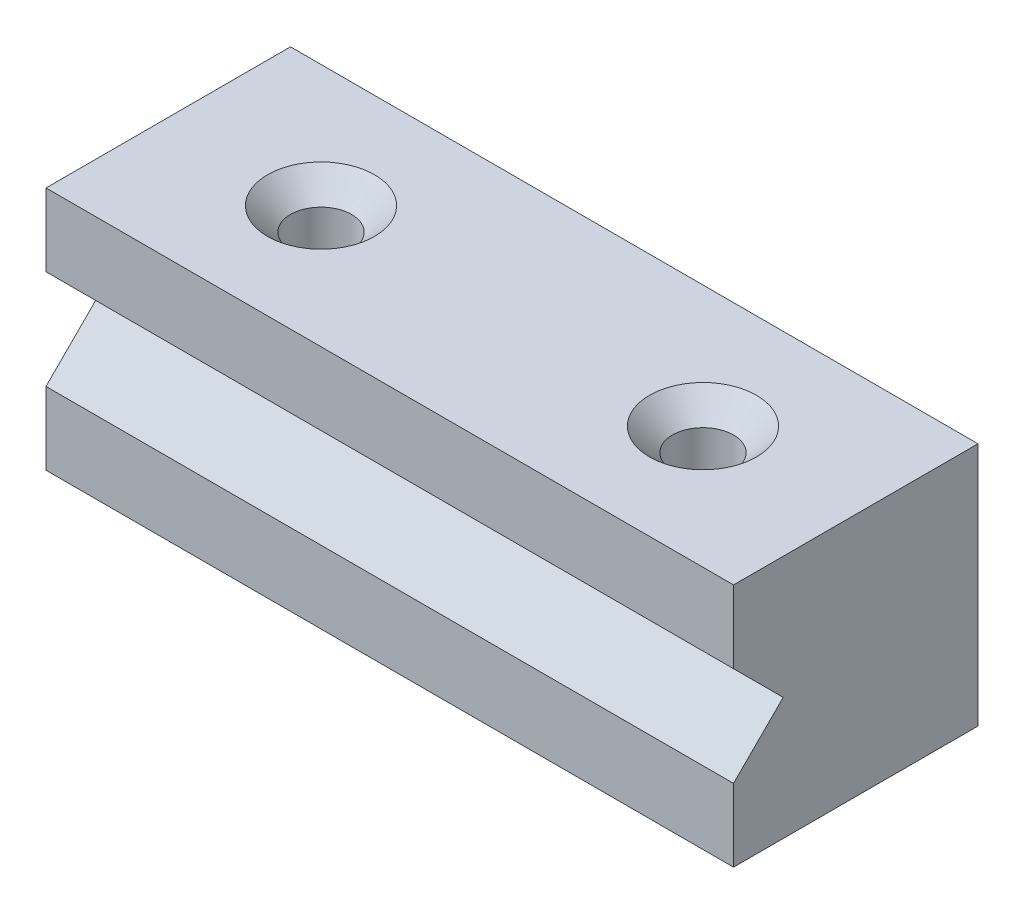
ISO-10303-21;
HEADER;
FILE_DESCRIPTION(('STEP AP214'),'2;1');
FILE_NAME('part.step','',(''),(''),'','','');
FILE_SCHEMA(('AUTOMOTIVE_DESIGN { 1 0 10303 214 1 1 1 1 }'));
ENDSEC;
DATA;
#1=APPLICATION_CONTEXT('core data for automotive mechanical design processes');
#2=APPLICATION_PROTOCOL_DEFINITION('international standard','automotive_design',2000,#1);
#3=PRODUCT_CONTEXT('',#1,'mechanical');
#4=PRODUCT('Part','Part','',(#3));
#5=PRODUCT_RELATED_PRODUCT_CATEGORY('part','',(#4));
#6=PRODUCT_DEFINITION_FORMATION('','',#4);
#7=PRODUCT_DEFINITION_CONTEXT('part definition',#1,'design');
#8=PRODUCT_DEFINITION('design','',#6,#7);
#9=PRODUCT_DEFINITION_SHAPE('','',#8);
#10=(LENGTH_UNIT() NAMED_UNIT(*) SI_UNIT(.MILLI.,.METRE.));
#11=(NAMED_UNIT(*) PLANE_ANGLE_UNIT() SI_UNIT($,.RADIAN.));
#12=(NAMED_UNIT(*) SI_UNIT($,.STERADIAN.) SOLID_ANGLE_UNIT());
#13=UNCERTAINTY_MEASURE_WITH_UNIT(LENGTH_MEASURE(1.E-05),#10,'distance_accuracy_value','');
#14=(GEOMETRIC_REPRESENTATION_CONTEXT(3) GLOBAL_UNCERTAINTY_ASSIGNED_CONTEXT((#13)) GLOBAL_UNIT_ASSIGNED_CONTEXT((#10,
#11,#12)) REPRESENTATION_CONTEXT('',''));
#15=CARTESIAN_POINT('',(0.,0.,0.));
#16=DIRECTION('',(0.,0.,1.));
#17=DIRECTION('',(1.,0.,0.));
#18=AXIS2_PLACEMENT_3D('',#15,#16,#17);
#19=CARTESIAN_POINT('',(45.,-4.74999999999999,4.74999999999997));
#20=DIRECTION('',(0.,0.707106781186549,-0.707106781186546));
#21=DIRECTION('',(0.,0.707106781186546,0.707106781186549));
#22=AXIS2_PLACEMENT_3D('',#19,#20,#21);
#23=PLANE('',#22);
#24=DIRECTION('',(0.,-0.707106781186546,-0.707106781186549));
#25=VECTOR('',#24,1.);
#26=CARTESIAN_POINT('',(-45.,-4.74999999999999,4.74999999999997));
#27=LINE('',#26,#25);
#28=CARTESIAN_POINT('',(-45.,6.5,16.));
#29=VERTEX_POINT('',#28);
#30=CARTESIAN_POINT('',(-45.,0.,9.49999999999998));
#31=VERTEX_POINT('',#30);
#32=EDGE_CURVE('E139',#29,#31,#27,.T.);
#33=ORIENTED_EDGE('',*,*,#32,.T.);
#34=DIRECTION('',(-1.,0.,0.));
#35=VECTOR('',#34,1.);
#36=CARTESIAN_POINT('',(45.,0.,9.49999999999998));
#37=LINE('',#36,#35);
#38=CARTESIAN_POINT('',(45.,0.,9.49999999999998));
#39=VERTEX_POINT('',#38);
#40=EDGE_CURVE('E173',#39,#31,#37,.T.);
#41=ORIENTED_EDGE('',*,*,#40,.F.);
#42=DIRECTION('',(0.,-0.707106781186546,-0.707106781186549));
#43=VECTOR('',#42,1.);
#44=CARTESIAN_POINT('',(45.,-4.74999999999999,4.74999999999997));
#45=LINE('',#44,#43);
#46=CARTESIAN_POINT('',(45.,6.5,16.));
#47=VERTEX_POINT('',#46);
#48=EDGE_CURVE('E210',#47,#39,#45,.T.);
#49=ORIENTED_EDGE('',*,*,#48,.F.);
#50=DIRECTION('',(-1.,0.,0.));
#51=VECTOR('',#50,1.);
#52=CARTESIAN_POINT('',(45.,6.5,16.));
#53=LINE('',#52,#51);
#54=EDGE_CURVE('E134',#47,#29,#53,.T.);
#55=ORIENTED_EDGE('',*,*,#54,.T.);
#56=EDGE_LOOP('',(#33,#41,#49,#55));
#57=FACE_BOUND('',#56,.T.);
#58=ADVANCED_FACE('F42',(#57),#23,.F.);
#59=CARTESIAN_POINT('',(45.,4.74999999999999,4.74999999999997));
#60=DIRECTION('',(0.,-0.707106781186549,-0.707106781186546));
#61=DIRECTION('',(0.,0.707106781186546,-0.707106781186549));
#62=AXIS2_PLACEMENT_3D('',#59,#60,#61);
#63=PLANE('',#62);
#64=DIRECTION('',(0.,-0.707106781186546,0.707106781186549));
#65=VECTOR('',#64,1.);
#66=CARTESIAN_POINT('',(-45.,4.74999999999999,4.74999999999997));
#67=LINE('',#66,#65);
#68=CARTESIAN_POINT('',(-45.,-6.5,16.));
#69=VERTEX_POINT('',#68);
#70=EDGE_CURVE('E143',#31,#69,#67,.T.);
#71=ORIENTED_EDGE('',*,*,#70,.T.);
#72=DIRECTION('',(-1.,0.,0.));
#73=VECTOR('',#72,1.);
#74=CARTESIAN_POINT('',(45.,-6.5,16.));
#75=LINE('',#74,#73);
#76=CARTESIAN_POINT('',(45.,-6.5,16.));
#77=VERTEX_POINT('',#76);
#78=EDGE_CURVE('E169',#77,#69,#75,.T.);
#79=ORIENTED_EDGE('',*,*,#78,.F.);
#80=DIRECTION('',(0.,-0.707106781186546,0.707106781186549));
#81=VECTOR('',#80,1.);
#82=CARTESIAN_POINT('',(45.,4.74999999999999,4.74999999999997));
#83=LINE('',#82,#81);
#84=EDGE_CURVE('E98',#39,#77,#83,.T.);
#85=ORIENTED_EDGE('',*,*,#84,.F.);
#86=ORIENTED_EDGE('',*,*,#40,.T.);
#87=EDGE_LOOP('',(#71,#79,#85,#86));
#88=FACE_BOUND('',#87,.T.);
#89=ADVANCED_FACE('F241',(#88),#63,.F.);
#90=CARTESIAN_POINT('',(45.,0.,16.));
#91=DIRECTION('',(0.,0.,-1.));
#92=DIRECTION('',(0.,1.,0.));
#93=AXIS2_PLACEMENT_3D('',#90,#91,#92);
#94=PLANE('',#93);
#95=DIRECTION('',(0.,-1.,0.));
#96=VECTOR('',#95,1.);
#97=CARTESIAN_POINT('',(-45.,0.,16.));
#98=LINE('',#97,#96);
#99=CARTESIAN_POINT('',(-45.,-16.,16.));
#100=VERTEX_POINT('',#99);
#101=EDGE_CURVE('E147',#69,#100,#98,.T.);
#102=ORIENTED_EDGE('',*,*,#101,.T.);
#103=DIRECTION('',(-1.,0.,0.));
#104=VECTOR('',#103,1.);
#105=CARTESIAN_POINT('',(45.,-16.,16.));
#106=LINE('',#105,#104);
#107=CARTESIAN_POINT('',(45.,-16.,16.));
#108=VERTEX_POINT('',#107);
#109=EDGE_CURVE('E165',#108,#100,#106,.T.);
#110=ORIENTED_EDGE('',*,*,#109,.F.);
#111=DIRECTION('',(0.,-1.,0.));
#112=VECTOR('',#111,1.);
#113=CARTESIAN_POINT('',(45.,0.,16.));
#114=LINE('',#113,#112);
#115=EDGE_CURVE('E136',#77,#108,#114,.T.);
#116=ORIENTED_EDGE('',*,*,#115,.F.);
#117=ORIENTED_EDGE('',*,*,#78,.T.);
#118=EDGE_LOOP('',(#102,#110,#116,#117));
#119=FACE_BOUND('',#118,.T.);
#120=ADVANCED_FACE('F220',(#119),#94,.F.);
#121=CARTESIAN_POINT('',(45.,-16.,0.));
#122=DIRECTION('',(0.,1.,0.));
#123=DIRECTION('',(0.,0.,1.));
#124=AXIS2_PLACEMENT_3D('',#121,#122,#123);
#125=PLANE('',#124);
#126=CARTESIAN_POINT('',(25.,-16.,0.));
#127=DIRECTION('',(0.,1.,0.));
#128=DIRECTION('',(0.,0.,1.));
#129=AXIS2_PLACEMENT_3D('',#126,#127,#128);
#130=CIRCLE('',#129,4.);
#131=CARTESIAN_POINT('',(25.,-16.,4.));
#132=VERTEX_POINT('',#131);
#133=EDGE_CURVE('E204',#132,#132,#130,.T.);
#134=ORIENTED_EDGE('',*,*,#133,.T.);
#135=EDGE_LOOP('',(#134));
#136=FACE_BOUND('',#135,.T.);
#137=CARTESIAN_POINT('',(-25.,-16.,0.));
#138=DIRECTION('',(0.,1.,0.));
#139=DIRECTION('',(0.,0.,1.));
#140=AXIS2_PLACEMENT_3D('',#137,#138,#139);
#141=CIRCLE('',#140,4.);
#142=CARTESIAN_POINT('',(-25.,-16.,4.));
#143=VERTEX_POINT('',#142);
#144=EDGE_CURVE('E144',#143,#143,#141,.T.);
#145=ORIENTED_EDGE('',*,*,#144,.T.);
#146=EDGE_LOOP('',(#145));
#147=FACE_BOUND('',#146,.T.);
#148=DIRECTION('',(0.,0.,-1.));
#149=VECTOR('',#148,1.);
#150=CARTESIAN_POINT('',(-45.,-16.,0.));
#151=LINE('',#150,#149);
#152=CARTESIAN_POINT('',(-45.,-16.,-16.));
#153=VERTEX_POINT('',#152);
#154=EDGE_CURVE('E150',#100,#153,#151,.T.);
#155=ORIENTED_EDGE('',*,*,#154,.T.);
#156=DIRECTION('',(-1.,0.,0.));
#157=VECTOR('',#156,1.);
#158=CARTESIAN_POINT('',(45.,-16.,-16.));
#159=LINE('',#158,#157);
#160=CARTESIAN_POINT('',(45.,-16.,-16.));
#161=VERTEX_POINT('',#160);
#162=EDGE_CURVE('E121',#161,#153,#159,.T.);
#163=ORIENTED_EDGE('',*,*,#162,.F.);
#164=DIRECTION('',(0.,0.,-1.));
#165=VECTOR('',#164,1.);
#166=CARTESIAN_POINT('',(45.,-16.,0.));
#167=LINE('',#166,#165);
#168=EDGE_CURVE('E126',#108,#161,#167,.T.);
#169=ORIENTED_EDGE('',*,*,#168,.F.);
#170=ORIENTED_EDGE('',*,*,#109,.T.);
#171=EDGE_LOOP('',(#155,#163,#169,#170));
#172=FACE_BOUND('',#171,.T.);
#173=ADVANCED_FACE('F224',(#136,#147,#172),#125,.F.);
#174=CARTESIAN_POINT('',(45.,0.,-16.));
#175=DIRECTION('',(0.,0.,-1.));
#176=DIRECTION('',(0.,1.,0.));
#177=AXIS2_PLACEMENT_3D('',#174,#175,#176);
#178=PLANE('',#177);
#179=DIRECTION('',(0.,-1.,0.));
#180=VECTOR('',#179,1.);
#181=CARTESIAN_POINT('',(-45.,0.,-16.));
#182=LINE('',#181,#180);
#183=CARTESIAN_POINT('',(-45.,16.,-16.));
#184=VERTEX_POINT('',#183);
#185=EDGE_CURVE('E115',#184,#153,#182,.T.);
#186=ORIENTED_EDGE('',*,*,#185,.F.);
#187=DIRECTION('',(-1.,0.,0.));
#188=VECTOR('',#187,1.);
#189=CARTESIAN_POINT('',(45.,16.,-16.));
#190=LINE('',#189,#188);
#191=CARTESIAN_POINT('',(45.,16.,-16.));
#192=VERTEX_POINT('',#191);
#193=EDGE_CURVE('E110',#192,#184,#190,.T.);
#194=ORIENTED_EDGE('',*,*,#193,.F.);
#195=DIRECTION('',(0.,-1.,0.));
#196=VECTOR('',#195,1.);
#197=CARTESIAN_POINT('',(45.,0.,-16.));
#198=LINE('',#197,#196);
#199=EDGE_CURVE('E113',#192,#161,#198,.T.);
#200=ORIENTED_EDGE('',*,*,#199,.T.);
#201=ORIENTED_EDGE('',*,*,#162,.T.);
#202=EDGE_LOOP('',(#186,#194,#200,#201));
#203=FACE_BOUND('',#202,.T.);
#204=ADVANCED_FACE('F112',(#203),#178,.T.);
#205=CARTESIAN_POINT('',(45.,16.,0.));
#206=DIRECTION('',(0.,1.,0.));
#207=DIRECTION('',(0.,0.,1.));
#208=AXIS2_PLACEMENT_3D('',#205,#206,#207);
#209=PLANE('',#208);
#210=CARTESIAN_POINT('',(-25.,16.,0.));
#211=DIRECTION('',(0.,1.,0.));
#212=DIRECTION('',(0.,0.,1.));
#213=AXIS2_PLACEMENT_3D('',#210,#211,#212);
#214=CIRCLE('',#213,7.00000000000003);
#215=CARTESIAN_POINT('',(-25.,16.,7.00000000000003));
#216=VERTEX_POINT('',#215);
#217=EDGE_CURVE('E53',#216,#216,#214,.F.);
#218=ORIENTED_EDGE('',*,*,#217,.T.);
#219=EDGE_LOOP('',(#218));
#220=FACE_BOUND('',#219,.T.);
#221=CARTESIAN_POINT('',(25.,16.,0.));
#222=DIRECTION('',(0.,1.,0.));
#223=DIRECTION('',(0.,0.,1.));
#224=AXIS2_PLACEMENT_3D('',#221,#222,#223);
#225=CIRCLE('',#224,7.00000000000003);
#226=CARTESIAN_POINT('',(25.,16.,7.00000000000003));
#227=VERTEX_POINT('',#226);
#228=EDGE_CURVE('E180',#227,#227,#225,.F.);
#229=ORIENTED_EDGE('',*,*,#228,.T.);
#230=EDGE_LOOP('',(#229));
#231=FACE_BOUND('',#230,.T.);
#232=DIRECTION('',(0.,0.,-1.));
#233=VECTOR('',#232,1.);
#234=CARTESIAN_POINT('',(-45.,16.,0.));
#235=LINE('',#234,#233);
#236=CARTESIAN_POINT('',(-45.,16.,16.));
#237=VERTEX_POINT('',#236);
#238=EDGE_CURVE('E156',#237,#184,#235,.T.);
#239=ORIENTED_EDGE('',*,*,#238,.F.);
#240=DIRECTION('',(-1.,0.,0.));
#241=VECTOR('',#240,1.);
#242=CARTESIAN_POINT('',(45.,16.,16.));
#243=LINE('',#242,#241);
#244=CARTESIAN_POINT('',(45.,16.,16.));
#245=VERTEX_POINT('',#244);
#246=EDGE_CURVE('E86',#245,#237,#243,.T.);
#247=ORIENTED_EDGE('',*,*,#246,.F.);
#248=DIRECTION('',(0.,0.,-1.));
#249=VECTOR('',#248,1.);
#250=CARTESIAN_POINT('',(45.,16.,0.));
#251=LINE('',#250,#249);
#252=EDGE_CURVE('E124',#245,#192,#251,.T.);
#253=ORIENTED_EDGE('',*,*,#252,.T.);
#254=ORIENTED_EDGE('',*,*,#193,.T.);
#255=EDGE_LOOP('',(#239,#247,#253,#254));
#256=FACE_BOUND('',#255,.T.);
#257=ADVANCED_FACE('F130',(#220,#231,#256),#209,.T.);
#258=EDGE_CURVE('E89',#237,#29,#98,.T.);
#259=ORIENTED_EDGE('',*,*,#258,.T.);
#260=ORIENTED_EDGE('',*,*,#54,.F.);
#261=EDGE_CURVE('E61',#245,#47,#114,.T.);
#262=ORIENTED_EDGE('',*,*,#261,.F.);
#263=ORIENTED_EDGE('',*,*,#246,.T.);
#264=EDGE_LOOP('',(#259,#260,#262,#263));
#265=FACE_BOUND('',#264,.T.);
#266=ADVANCED_FACE('F230',(#265),#94,.F.);
#267=CARTESIAN_POINT('',(45.,0.,0.));
#268=DIRECTION('',(1.,0.,0.));
#269=DIRECTION('',(0.,0.,-1.));
#270=AXIS2_PLACEMENT_3D('',#267,#268,#269);
#271=PLANE('',#270);
#272=ORIENTED_EDGE('',*,*,#48,.T.);
#273=ORIENTED_EDGE('',*,*,#84,.T.);
#274=ORIENTED_EDGE('',*,*,#115,.T.);
#275=ORIENTED_EDGE('',*,*,#168,.T.);
#276=ORIENTED_EDGE('',*,*,#199,.F.);
#277=ORIENTED_EDGE('',*,*,#252,.F.);
#278=ORIENTED_EDGE('',*,*,#261,.T.);
#279=EDGE_LOOP('',(#272,#273,#274,#275,#276,#277,#278));
#280=FACE_BOUND('',#279,.T.);
#281=ADVANCED_FACE('F123',(#280),#271,.T.);
#282=CARTESIAN_POINT('',(-45.,0.,0.));
#283=DIRECTION('',(1.,0.,0.));
#284=DIRECTION('',(0.,0.,-1.));
#285=AXIS2_PLACEMENT_3D('',#282,#283,#284);
#286=PLANE('',#285);
#287=ORIENTED_EDGE('',*,*,#32,.F.);
#288=ORIENTED_EDGE('',*,*,#258,.F.);
#289=ORIENTED_EDGE('',*,*,#238,.T.);
#290=ORIENTED_EDGE('',*,*,#185,.T.);
#291=ORIENTED_EDGE('',*,*,#154,.F.);
#292=ORIENTED_EDGE('',*,*,#101,.F.);
#293=ORIENTED_EDGE('',*,*,#70,.F.);
#294=EDGE_LOOP('',(#287,#288,#289,#290,#291,#292,#293));
#295=FACE_BOUND('',#294,.T.);
#296=ADVANCED_FACE('F198',(#295),#286,.F.);
#297=CARTESIAN_POINT('',(-25.,16.,0.));
#298=DIRECTION('',(0.,1.,0.));
#299=DIRECTION('',(0.,0.,1.));
#300=AXIS2_PLACEMENT_3D('',#297,#298,#299);
#301=CYLINDRICAL_SURFACE('',#300,4.);
#302=CARTESIAN_POINT('',(-25.,13.,0.));
#303=DIRECTION('',(0.,1.,0.));
#304=DIRECTION('',(0.,0.,1.));
#305=AXIS2_PLACEMENT_3D('',#302,#303,#304);
#306=CIRCLE('',#305,4.);
#307=CARTESIAN_POINT('',(-25.,13.,4.));
#308=VERTEX_POINT('',#307);
#309=EDGE_CURVE('E176',#308,#308,#306,.T.);
#310=ORIENTED_EDGE('',*,*,#309,.T.);
#311=EDGE_LOOP('',(#310));
#312=FACE_BOUND('',#311,.T.);
#313=ORIENTED_EDGE('',*,*,#144,.F.);
#314=EDGE_LOOP('',(#313));
#315=FACE_BOUND('',#314,.T.);
#316=ADVANCED_FACE('F195',(#312,#315),#301,.F.);
#317=CARTESIAN_POINT('',(25.,16.,0.));
#318=DIRECTION('',(0.,1.,0.));
#319=DIRECTION('',(0.,0.,1.));
#320=AXIS2_PLACEMENT_3D('',#317,#318,#319);
#321=CYLINDRICAL_SURFACE('',#320,4.);
#322=CARTESIAN_POINT('',(25.,13.,0.));
#323=DIRECTION('',(0.,1.,0.));
#324=DIRECTION('',(0.,0.,1.));
#325=AXIS2_PLACEMENT_3D('',#322,#323,#324);
#326=CIRCLE('',#325,4.);
#327=CARTESIAN_POINT('',(25.,13.,4.));
#328=VERTEX_POINT('',#327);
#329=EDGE_CURVE('E11',#328,#328,#326,.T.);
#330=ORIENTED_EDGE('',*,*,#329,.T.);
#331=EDGE_LOOP('',(#330));
#332=FACE_BOUND('',#331,.T.);
#333=ORIENTED_EDGE('',*,*,#133,.F.);
#334=EDGE_LOOP('',(#333));
#335=FACE_BOUND('',#334,.T.);
#336=ADVANCED_FACE('F192',(#332,#335),#321,.F.);
#337=CARTESIAN_POINT('',(-25.,13.,0.));
#338=DIRECTION('',(0.,1.,0.));
#339=DIRECTION('',(0.,0.,1.));
#340=AXIS2_PLACEMENT_3D('',#337,#338,#339);
#341=CONICAL_SURFACE('',#340,4.,0.785398163397453);
#342=ORIENTED_EDGE('',*,*,#217,.F.);
#343=EDGE_LOOP('',(#342));
#344=FACE_BOUND('',#343,.T.);
#345=ORIENTED_EDGE('',*,*,#309,.F.);
#346=EDGE_LOOP('',(#345));
#347=FACE_BOUND('',#346,.T.);
#348=ADVANCED_FACE('F189',(#344,#347),#341,.F.);
#349=CARTESIAN_POINT('',(25.,13.,0.));
#350=DIRECTION('',(0.,1.,0.));
#351=DIRECTION('',(0.,0.,1.));
#352=AXIS2_PLACEMENT_3D('',#349,#350,#351);
#353=CONICAL_SURFACE('',#352,4.,0.785398163397453);
#354=ORIENTED_EDGE('',*,*,#228,.F.);
#355=EDGE_LOOP('',(#354));
#356=FACE_BOUND('',#355,.T.);
#357=ORIENTED_EDGE('',*,*,#329,.F.);
#358=EDGE_LOOP('',(#357));
#359=FACE_BOUND('',#358,.T.);
#360=ADVANCED_FACE('F45',(#356,#359),#353,.F.);
#361=CLOSED_SHELL('',(#58,#89,#120,#173,#204,#257,#266,#281,#296,#316,#336,#348,#360));
#362=MANIFOLD_SOLID_BREP('B2',#361);
#363=ADVANCED_BREP_SHAPE_REPRESENTATION('',(#18,#362),#14);
#364=SHAPE_DEFINITION_REPRESENTATION(#9,#363);
ENDSEC;
END-ISO-10303-21;
